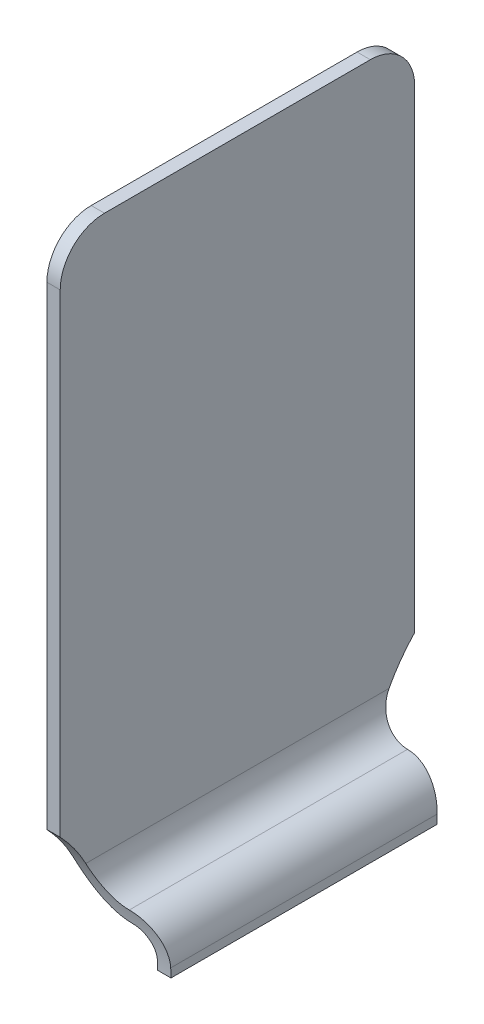
ISO-10303-21;
HEADER;
FILE_DESCRIPTION(('STEP AP214'),'2;1');
FILE_NAME('part.step','',(''),(''),'','','');
FILE_SCHEMA(('AUTOMOTIVE_DESIGN { 1 0 10303 214 1 1 1 1 }'));
ENDSEC;
DATA;
#1=APPLICATION_CONTEXT('core data for automotive mechanical design processes');
#2=APPLICATION_PROTOCOL_DEFINITION('international standard','automotive_design',2000,#1);
#3=PRODUCT_CONTEXT('',#1,'mechanical');
#4=PRODUCT('Part','Part','',(#3));
#5=PRODUCT_RELATED_PRODUCT_CATEGORY('part','',(#4));
#6=PRODUCT_DEFINITION_FORMATION('','',#4);
#7=PRODUCT_DEFINITION_CONTEXT('part definition',#1,'design');
#8=PRODUCT_DEFINITION('design','',#6,#7);
#9=PRODUCT_DEFINITION_SHAPE('','',#8);
#10=(LENGTH_UNIT() NAMED_UNIT(*) SI_UNIT(.MILLI.,.METRE.));
#11=(NAMED_UNIT(*) PLANE_ANGLE_UNIT() SI_UNIT($,.RADIAN.));
#12=(NAMED_UNIT(*) SI_UNIT($,.STERADIAN.) SOLID_ANGLE_UNIT());
#13=UNCERTAINTY_MEASURE_WITH_UNIT(LENGTH_MEASURE(1.E-05),#10,'distance_accuracy_value','');
#14=(GEOMETRIC_REPRESENTATION_CONTEXT(3) GLOBAL_UNCERTAINTY_ASSIGNED_CONTEXT((#13)) GLOBAL_UNIT_ASSIGNED_CONTEXT((#10,
#11,#12)) REPRESENTATION_CONTEXT('',''));
#15=CARTESIAN_POINT('',(0.,0.,0.));
#16=DIRECTION('',(0.,0.,1.));
#17=DIRECTION('',(1.,0.,0.));
#18=AXIS2_PLACEMENT_3D('',#15,#16,#17);
#19=CARTESIAN_POINT('',(-12.7,43.18,101.6));
#20=DIRECTION('',(0.,0.,-1.));
#21=DIRECTION('',(-1.,0.,0.));
#22=AXIS2_PLACEMENT_3D('',#19,#20,#21);
#23=CYLINDRICAL_SURFACE('',#22,25.4);
#24=DIRECTION('',(0.,0.,-1.));
#25=VECTOR('',#24,1.);
#26=CARTESIAN_POINT('',(-12.7,17.78,101.6));
#27=LINE('',#26,#25);
#28=CARTESIAN_POINT('',(-12.7,17.78,77.9314030595637));
#29=VERTEX_POINT('',#28);
#30=CARTESIAN_POINT('',(-12.7,17.78,-77.9314030595637));
#31=VERTEX_POINT('',#30);
#32=EDGE_CURVE('E180',#29,#31,#27,.T.);
#33=ORIENTED_EDGE('',*,*,#32,.F.);
#34=CARTESIAN_POINT('',(-12.7,17.78,77.9314030595637));
#35=CARTESIAN_POINT('',(-13.0499996478688,17.7799999557773,77.9314059119143));
#36=CARTESIAN_POINT('',(-13.3999568431683,17.7872354258862,77.9328253421466));
#37=CARTESIAN_POINT('',(-14.0992497530431,17.8161558254364,77.9385179026618));
#38=CARTESIAN_POINT('',(-14.448585468737,17.8378407288423,77.9427910278028));
#39=CARTESIAN_POINT('',(-15.4946792641457,17.9245225111332,77.9599188524083));
#40=CARTESIAN_POINT('',(-16.1897033388616,18.0111464859757,77.9770819818949));
#41=CARTESIAN_POINT('',(-17.5692690997434,18.2412934080639,78.0232516329426));
#42=CARTESIAN_POINT('',(-18.2538178524541,18.3847760670103,78.0522497690197));
#43=CARTESIAN_POINT('',(-19.6081739305384,18.7274954492978,78.1226996254696));
#44=CARTESIAN_POINT('',(-20.2779814894416,18.926731288711,78.1641511484035));
#45=CARTESIAN_POINT('',(-21.5984470615826,19.3794727905471,78.2603442526942));
#46=CARTESIAN_POINT('',(-22.2490937300239,19.6330098969838,78.3150935368045));
#47=CARTESIAN_POINT('',(-23.5262014706874,20.1921929563259,78.4388397647035));
#48=CARTESIAN_POINT('',(-24.1526623105987,20.4978394096021,78.5078368453056));
#49=CARTESIAN_POINT('',(-25.3768049016897,21.1585946020703,78.6611382409556));
#50=CARTESIAN_POINT('',(-25.9744925338651,21.5136931754192,78.7454394110295));
#51=CARTESIAN_POINT('',(-27.1370099880035,22.2703437940089,78.9304777410714));
#52=CARTESIAN_POINT('',(-27.7018400674534,22.6718954751478,79.0312147722169));
#53=CARTESIAN_POINT('',(-28.7936460318018,23.5170857901686,79.250002243268));
#54=CARTESIAN_POINT('',(-29.3206956673471,23.9606382736688,79.3680175032785));
#55=CARTESIAN_POINT('',(-30.3346875129469,24.8865809286975,79.6225097664561));
#56=CARTESIAN_POINT('',(-30.8216297923218,25.3689710330974,79.7589867377134));
#57=CARTESIAN_POINT('',(-31.752257755054,26.3681740201973,80.0512102841716));
#58=CARTESIAN_POINT('',(-32.1959530235636,26.8849792322877,80.2069525720158));
#59=CARTESIAN_POINT('',(-33.0376833220261,27.9485015261656,80.5383520470117));
#60=CARTESIAN_POINT('',(-33.4357183988762,28.4952185772301,80.7140092137085));
#61=CARTESIAN_POINT('',(-34.1869168527995,29.6178506732795,81.0869585391497));
#62=CARTESIAN_POINT('',(-34.5397305099014,30.1939501245122,81.2843996281286));
#63=CARTESIAN_POINT('',(-35.1956744872665,31.3666171452898,81.6999249263983));
#64=CARTESIAN_POINT('',(-35.4988035050755,31.9631852509131,81.9180096766144));
#65=CARTESIAN_POINT('',(-36.0548696654611,33.1723370569908,82.3747797484145));
#66=CARTESIAN_POINT('',(-36.3077604106159,33.7849349763711,82.6134838237389));
#67=CARTESIAN_POINT('',(-36.7628321467949,35.0207320762419,83.1107578036227));
#68=CARTESIAN_POINT('',(-36.9650165668085,35.6439305368311,83.3693263633108));
#69=CARTESIAN_POINT('',(-37.3045517222451,36.8449436479147,83.8834947192271));
#70=CARTESIAN_POINT('',(-37.4458604146121,37.4222874407772,84.1375979903023));
#71=CARTESIAN_POINT('',(-37.6867507737067,38.578784796141,84.661037335202));
#72=CARTESIAN_POINT('',(-37.7863309275198,39.1579384234931,84.9303739609269));
#73=CARTESIAN_POINT('',(-37.9444495280917,40.3134810876789,85.4825910422848));
#74=CARTESIAN_POINT('',(-38.0030931901244,40.8898734021302,85.7654347655192));
#75=CARTESIAN_POINT('',(-38.0808749708512,42.0386004944635,86.3441380062726));
#76=CARTESIAN_POINT('',(-38.100023441151,42.6109362963468,86.6399940925108));
#77=CARTESIAN_POINT('',(-38.1,43.18,86.9418470387659));
#78=B_SPLINE_CURVE_WITH_KNOTS('',3,(#34,#35,#36,#37,#38,#39,#40,#41,#42,#43,#44,#45,#46,#47,#48,
#49,#50,#51,#52,#53,#54,#55,#56,#57,#58,#59,#60,#61,#62,#63,#64,#65,#66,#67,#68,#69,#70,#71,#72,
#73,#74,#75,#76,#77),.UNSPECIFIED.,.F.,.F.,(4,2,2,2,2,2,2,2,2,2,2,2,2,2,2,2,2,2,2,2,2,4),(0.,
1.0498364949057,2.09967109818931,4.19880399000813,6.2964521533428,8.39406706181435,
10.4928999276561,12.5917529483054,14.6901751441252,16.7885808935242,18.8827720502677,
20.9769595874038,23.070681913896,25.1644020899185,27.2734454668524,29.3825441222987,
31.4935816660127,33.6044764133687,35.5422056132227,37.4800050615188,39.4128054407513,
41.3450991727097),.UNSPECIFIED.);
#79=CARTESIAN_POINT('',(-38.1,43.18,86.9418470387659));
#80=VERTEX_POINT('',#79);
#81=EDGE_CURVE('E333',#29,#80,#78,.T.);
#82=ORIENTED_EDGE('',*,*,#81,.T.);
#83=DIRECTION('',(0.,0.,-1.));
#84=VECTOR('',#83,1.);
#85=CARTESIAN_POINT('',(-38.1,43.18,101.6));
#86=LINE('',#85,#84);
#87=CARTESIAN_POINT('',(-38.1,43.18,-86.9418470387659));
#88=VERTEX_POINT('',#87);
#89=EDGE_CURVE('E184',#80,#88,#86,.T.);
#90=ORIENTED_EDGE('',*,*,#89,.T.);
#91=CARTESIAN_POINT('',(-38.1,43.18,-86.9418470387659));
#92=CARTESIAN_POINT('',(-38.0999981693521,42.8330676130882,-86.7578451581963));
#93=CARTESIAN_POINT('',(-38.0928908293818,42.4849863241756,-86.5760818146419));
#94=CARTESIAN_POINT('',(-38.0641788020595,41.7869805251087,-86.2172414157792));
#95=CARTESIAN_POINT('',(-38.0425730507946,41.4370558815564,-86.0401647053736));
#96=CARTESIAN_POINT('',(-37.9555603179967,40.3850357204068,-85.5161989694547));
#97=CARTESIAN_POINT('',(-37.8679574640963,39.6809320093932,-85.1767005439162));
#98=CARTESIAN_POINT('',(-37.6313412002912,38.2707222316856,-84.5185077883108));
#99=CARTESIAN_POINT('',(-37.4821448284482,37.5646164773349,-84.1998787454774));
#100=CARTESIAN_POINT('',(-37.1209546509072,36.1583347479351,-83.5861659913778));
#101=CARTESIAN_POINT('',(-36.9089726551131,35.45815768316,-83.2910778653304));
#102=CARTESIAN_POINT('',(-36.420533884373,34.0672823051014,-82.7245567397836));
#103=CARTESIAN_POINT('',(-36.1438302565169,33.3766312821225,-82.4532199158361));
#104=CARTESIAN_POINT('',(-35.526489905651,32.01440422067,-81.9363097318033));
#105=CARTESIAN_POINT('',(-35.1858487365238,31.3428295124752,-81.6907381652466));
#106=CARTESIAN_POINT('',(-34.4423974173309,30.0271275886868,-81.2261628884651));
#107=CARTESIAN_POINT('',(-34.0397019823121,29.3829524700522,-81.0071114603769));
#108=CARTESIAN_POINT('',(-33.1737671204304,28.1278915350359,-80.5949258524575));
#109=CARTESIAN_POINT('',(-32.7105333250935,27.5170026297149,-80.4017892653047));
#110=CARTESIAN_POINT('',(-31.7648053912232,26.3813053571327,-80.0548262623317));
#111=CARTESIAN_POINT('',(-31.2866002111259,25.8534962347817,-79.8991119010135));
#112=CARTESIAN_POINT('',(-30.2843545412095,24.8371607335537,-79.6083885940629));
#113=CARTESIAN_POINT('',(-29.7603160004625,24.3486326859357,-79.4733787686378));
#114=CARTESIAN_POINT('',(-28.6698046782257,23.4153684525297,-79.2229751783637));
#115=CARTESIAN_POINT('',(-28.1033121804295,22.9706528386449,-79.1075906101558));
#116=CARTESIAN_POINT('',(-26.9322806062266,22.1295405672176,-78.895326368492));
#117=CARTESIAN_POINT('',(-26.3277426897863,21.7331424376049,-78.7984461312208));
#118=CARTESIAN_POINT('',(-25.1089177110038,21.0065289183651,-78.6252963549697));
#119=CARTESIAN_POINT('',(-24.4958819412428,20.6743659026675,-78.5483816367503));
#120=CARTESIAN_POINT('',(-23.2431697786311,20.0610051316673,-78.4093863283812));
#121=CARTESIAN_POINT('',(-22.6034924368255,19.7798091936907,-78.3473062671636));
#122=CARTESIAN_POINT('',(-21.3025735411414,19.2709367206486,-78.2369882901384));
#123=CARTESIAN_POINT('',(-20.6413471356047,19.04322347514,-78.1887408745731));
#124=CARTESIAN_POINT('',(-19.3017164175427,18.642971428121,-78.1051360807845));
#125=CARTESIAN_POINT('',(-18.6233164764861,18.4704187350813,-78.0697754568614));
#126=CARTESIAN_POINT('',(-17.5084533745084,18.2354135933635,-78.0220937195489));
#127=CARTESIAN_POINT('',(-17.0756676243027,18.1558684230535,-78.0060927585808));
#128=CARTESIAN_POINT('',(-16.2064122464161,18.0193448690089,-77.9787660319519));
#129=CARTESIAN_POINT('',(-15.7699429172649,17.9623646741324,-77.967439891071));
#130=CARTESIAN_POINT('',(-14.895222364713,17.8712260423907,-77.9493754668979));
#131=CARTESIAN_POINT('',(-14.4569749313765,17.8370325168362,-77.9426301294209));
#132=CARTESIAN_POINT('',(-13.5791533090422,17.7914109529349,-77.9336470047907));
#133=CARTESIAN_POINT('',(-13.1395788474447,17.7799879633423,-77.931410217286));
#134=CARTESIAN_POINT('',(-12.7,17.78,-77.9314030595637));
#135=B_SPLINE_CURVE_WITH_KNOTS('',3,(#91,#92,#93,#94,#95,#96,#97,#98,#99,#100,#101,#102,#103,
#104,#105,#106,#107,#108,#109,#110,#111,#112,#113,#114,#115,#116,#117,#118,#119,#120,#121,#122,
#123,#124,#125,#126,#127,#128,#129,#130,#131,#132,#133,#134),.UNSPECIFIED.,.F.,.F.,(4,2,2,2,2,2,
2,2,2,2,2,2,2,2,2,2,2,2,2,2,2,4),(0.,1.17797477451778,2.35603599986318,4.71296445194622,
7.07694505774292,9.44048128358467,11.813183592158,14.1860509559387,16.5545832675684,
18.9228954052615,21.1072999465287,23.2916116407126,25.4769441272627,27.6622100174723,
29.7641273915488,31.8661196986582,33.9666649569446,36.066680800374,37.3871066093628,
38.7074264149734,40.0257083620563,41.3442825702244),.UNSPECIFIED.);
#136=EDGE_CURVE('E305',#88,#31,#135,.T.);
#137=ORIENTED_EDGE('',*,*,#136,.T.);
#138=EDGE_LOOP('',(#33,#82,#90,#137));
#139=FACE_BOUND('',#138,.T.);
#140=ADVANCED_FACE('F39',(#139),#23,.T.);
#141=CARTESIAN_POINT('',(-12.7,5.08,101.6));
#142=DIRECTION('',(0.,0.,-1.));
#143=DIRECTION('',(-1.,0.,0.));
#144=AXIS2_PLACEMENT_3D('',#141,#142,#143);
#145=CYLINDRICAL_SURFACE('',#144,12.7);
#146=DIRECTION('',(0.,0.,-1.));
#147=VECTOR('',#146,1.);
#148=CARTESIAN_POINT('',(0.,5.08,101.6));
#149=LINE('',#148,#147);
#150=CARTESIAN_POINT('',(0.,5.08,76.3401178551405));
#151=VERTEX_POINT('',#150);
#152=CARTESIAN_POINT('',(0.,5.08,-76.3401178551405));
#153=VERTEX_POINT('',#152);
#154=EDGE_CURVE('E171',#151,#153,#149,.T.);
#155=ORIENTED_EDGE('',*,*,#154,.F.);
#156=CARTESIAN_POINT('',(0.,5.08,76.3401178551405));
#157=CARTESIAN_POINT('',(3.96927819026589E-05,5.43752790905718,76.3598347523089));
#158=CARTESIAN_POINT('',(-0.0150957553515693,5.79492545381099,76.381675717507));
#159=CARTESIAN_POINT('',(-0.0753669800947612,6.50687834594197,76.4293110483744));
#160=CARTESIAN_POINT('',(-0.120499422788845,6.86143400473958,76.4551049744598));
#161=CARTESIAN_POINT('',(-0.240342131811877,7.56477559518426,76.5103225082011));
#162=CARTESIAN_POINT('',(-0.315016469484502,7.91356800123989,76.5397416770472));
#163=CARTESIAN_POINT('',(-0.493332468328808,8.60337293254157,76.6018067682278));
#164=CARTESIAN_POINT('',(-0.596974247098192,8.94438542619781,76.6344527036616));
#165=CARTESIAN_POINT('',(-0.832455324071245,9.61631414718369,76.7024611682484));
#166=CARTESIAN_POINT('',(-0.964299310933864,9.94722868524757,76.7378241484871));
#167=CARTESIAN_POINT('',(-1.25520299821368,10.5966302700931,76.8106599822474));
#168=CARTESIAN_POINT('',(-1.41426292314273,10.9151172143294,76.8481328531723));
#169=CARTESIAN_POINT('',(-1.75846357221544,11.5374948982324,76.9245167753253));
#170=CARTESIAN_POINT('',(-1.94360466066444,11.8413854339349,76.9634278466369));
#171=CARTESIAN_POINT('',(-2.33867478858657,12.4325041341637,77.0419601051874));
#172=CARTESIAN_POINT('',(-2.54860387535117,12.7197322668994,77.081581293781));
#173=CARTESIAN_POINT('',(-2.99359206530483,13.277806242217,77.1610844760511));
#174=CARTESIAN_POINT('',(-3.22883909025521,13.5485023382348,77.2009660149684));
#175=CARTESIAN_POINT('',(-3.72144798701313,14.0691061196502,77.2798627068802));
#176=CARTESIAN_POINT('',(-3.97881010269379,14.3190135757423,77.3188778503145));
#177=CARTESIAN_POINT('',(-4.5139378515299,14.7963241491371,77.3952339956737));
#178=CARTESIAN_POINT('',(-4.79170718956348,15.0237231624135,77.4325746916156));
#179=CARTESIAN_POINT('',(-5.36569981734714,15.454331834241,77.5047726281614));
#180=CARTESIAN_POINT('',(-5.66192275437705,15.6575419549202,77.5396299162057));
#181=CARTESIAN_POINT('',(-6.27084994830883,16.0383301873063,77.6061018534412));
#182=CARTESIAN_POINT('',(-6.58355778120708,16.2159027060666,77.6377157946492));
#183=CARTESIAN_POINT('',(-7.22320083425029,16.5440254840768,77.6969789088967));
#184=CARTESIAN_POINT('',(-7.55013596302429,16.694575916837,77.7246281073938));
#185=CARTESIAN_POINT('',(-8.21572254412766,16.9674094840857,77.7753082807231));
#186=CARTESIAN_POINT('',(-8.5543666539122,17.0897099769576,77.7983420903555));
#187=CARTESIAN_POINT('',(-9.24096045999227,17.3051605665581,77.8392660710178));
#188=CARTESIAN_POINT('',(-9.58890766474032,17.3983183850291,77.8571576044606));
#189=CARTESIAN_POINT('',(-10.3929279231379,17.5772834826273,77.8917207133021));
#190=CARTESIAN_POINT('',(-10.8513278723684,17.6532778862178,77.9065627944645));
#191=CARTESIAN_POINT('',(-11.5427044363044,17.7292874839319,77.9214435153492));
#192=CARTESIAN_POINT('',(-11.7736871687955,17.748293659439,77.9251733349672));
#193=CARTESIAN_POINT('',(-12.2364273939095,17.7736506362101,77.9301543152291));
#194=CARTESIAN_POINT('',(-12.4681850559713,17.7799984600104,77.9314048927119));
#195=CARTESIAN_POINT('',(-12.7,17.78,77.9314030595637));
#196=B_SPLINE_CURVE_WITH_KNOTS('',3,(#156,#157,#158,#159,#160,#161,#162,#163,#164,#165,#166,
#167,#168,#169,#170,#171,#172,#173,#174,#175,#176,#177,#178,#179,#180,#181,#182,#183,#184,#185,
#186,#187,#188,#189,#190,#191,#192,#193,#194,#195),.UNSPECIFIED.,.F.,.F.,(4,2,2,2,2,2,2,2,2,2,2,
2,2,2,2,2,2,2,2,4),(0.,1.07386842981975,2.14761752807789,3.22006473472719,4.2925162952012,
5.36514629110684,6.4377851358629,7.51043896487447,8.58309484036843,9.66434758803104,
10.7456122606879,11.8270737215355,12.9085145177793,13.9901908793923,15.0718602952567,
16.1528632927998,17.2335796210278,18.6249933697159,19.3200703527697,20.0153108107023),.UNSPECIFIED.);
#197=EDGE_CURVE('E324',#151,#29,#196,.T.);
#198=ORIENTED_EDGE('',*,*,#197,.T.);
#199=ORIENTED_EDGE('',*,*,#32,.T.);
#200=CARTESIAN_POINT('',(-12.7,17.78,-77.9314030595637));
#201=CARTESIAN_POINT('',(-12.3466949631906,17.7800420056863,-77.9314271102359));
#202=CARTESIAN_POINT('',(-11.9933997492598,17.7652587799894,-77.9285050771935));
#203=CARTESIAN_POINT('',(-11.28939587927,17.7063481566282,-77.9169433645126));
#204=CARTESIAN_POINT('',(-10.9386869446652,17.6622239671092,-77.9083043099744));
#205=CARTESIAN_POINT('',(-10.2428545285002,17.5450235402421,-77.8854997296049));
#206=CARTESIAN_POINT('',(-9.89772361347375,17.471989834535,-77.8713423228317));
#207=CARTESIAN_POINT('',(-9.21496697125733,17.2975558808309,-77.8378349513846));
#208=CARTESIAN_POINT('',(-8.87734124861482,17.1961556156467,-77.8184849835647));
#209=CARTESIAN_POINT('',(-8.21190089354484,16.9657464721929,-77.7750274232528));
#210=CARTESIAN_POINT('',(-7.88408791528717,16.8367329686031,-77.7509190337603));
#211=CARTESIAN_POINT('',(-7.24058370452112,16.5520773039718,-77.698486498422));
#212=CARTESIAN_POINT('',(-6.92489263830984,16.3964347777738,-77.6701622947665));
#213=CARTESIAN_POINT('',(-6.30775984721356,16.0596557867702,-77.6099180630512));
#214=CARTESIAN_POINT('',(-6.00631875750772,15.8785181869746,-77.5779978749178));
#215=CARTESIAN_POINT('',(-5.41971072222315,15.4920487054655,-77.5112472343013));
#216=CARTESIAN_POINT('',(-5.134543847533,15.2867167183761,-77.4764167691429));
#217=CARTESIAN_POINT('',(-4.57933045938471,14.8509076539266,-77.4041797688339));
#218=CARTESIAN_POINT('',(-4.30948434724324,14.6201792384612,-77.3667491476165));
#219=CARTESIAN_POINT('',(-3.79015231891764,14.1370632592111,-77.2904385720636));
#220=CARTESIAN_POINT('',(-3.54066663496979,13.884675448441,-77.2515586012038));
#221=CARTESIAN_POINT('',(-3.06367311321691,13.3599128025082,-77.1731297502517));
#222=CARTESIAN_POINT('',(-2.83617026994782,13.0875334498548,-77.1335807205353));
#223=CARTESIAN_POINT('',(-2.40474283813566,12.5246901986731,-77.0546031710346));
#224=CARTESIAN_POINT('',(-2.20081805776936,12.2342264473032,-77.0151746502723));
#225=CARTESIAN_POINT('',(-1.81554297995369,11.6334357962443,-76.9367037926197));
#226=CARTESIAN_POINT('',(-1.63450662544897,11.3229060383154,-76.8976724387105));
#227=CARTESIAN_POINT('',(-1.29932576880851,10.6874658170685,-76.8212436702971));
#228=CARTESIAN_POINT('',(-1.14518145465169,10.3625552532467,-76.7838462672158));
#229=CARTESIAN_POINT('',(-0.864987959785353,9.70076869641039,-76.7113798310754));
#230=CARTESIAN_POINT('',(-0.738924292048551,9.36389897770836,-76.6763096039955));
#231=CARTESIAN_POINT('',(-0.515778486381247,8.68055547672783,-76.6090865987976));
#232=CARTESIAN_POINT('',(-0.418689542219729,8.33408397086301,-76.5769331367617));
#233=CARTESIAN_POINT('',(-0.224871484110284,7.50878628738693,-76.5051718812074));
#234=CARTESIAN_POINT('',(-0.140612019132547,7.02681300189326,-76.4669935450762));
#235=CARTESIAN_POINT('',(-0.0562950150327749,6.29918810208349,-76.4152099649003));
#236=CARTESIAN_POINT('',(-0.03520141508771,6.05596605308697,-76.3988681373186));
#237=CARTESIAN_POINT('',(-0.00705358222639746,5.56853671523523,-76.368065107081));
#238=CARTESIAN_POINT('',(-2.53929975079959E-06,5.32432921514111,-76.3536043324332));
#239=CARTESIAN_POINT('',(0.,5.08,-76.3401178551405));
#240=B_SPLINE_CURVE_WITH_KNOTS('',3,(#200,#201,#202,#203,#204,#205,#206,#207,#208,#209,#210,
#211,#212,#213,#214,#215,#216,#217,#218,#219,#220,#221,#222,#223,#224,#225,#226,#227,#228,#229,
#230,#231,#232,#233,#234,#235,#236,#237,#238,#239),.UNSPECIFIED.,.F.,.F.,(4,2,2,2,2,2,2,2,2,2,2,
2,2,2,2,2,2,2,2,4),(0.,1.05957922329203,2.11904261108065,3.1769530765825,4.23486418307,
5.29295263247609,6.35105559231693,7.40920567170577,8.46736035992262,9.53713358255137,
10.6069190055826,11.6769469168349,12.7469661220855,13.8303566488204,14.9137547482945,
15.9965926128848,17.0791759157283,18.5477331027743,19.2814317836532,20.0152971168244),.UNSPECIFIED.);
#241=EDGE_CURVE('E296',#31,#153,#240,.T.);
#242=ORIENTED_EDGE('',*,*,#241,.T.);
#243=EDGE_LOOP('',(#155,#198,#199,#242));
#244=FACE_BOUND('',#243,.T.);
#245=ADVANCED_FACE('F313',(#244),#145,.F.);
#246=CARTESIAN_POINT('',(0.,0.,101.6));
#247=DIRECTION('',(-1.,0.,0.));
#248=DIRECTION('',(0.,0.,1.));
#249=AXIS2_PLACEMENT_3D('',#246,#247,#248);
#250=PLANE('',#249);
#251=DIRECTION('',(0.,0.,-1.));
#252=VECTOR('',#251,1.);
#253=CARTESIAN_POINT('',(0.,0.,101.6));
#254=LINE('',#253,#252);
#255=CARTESIAN_POINT('',(0.,0.,76.2));
#256=VERTEX_POINT('',#255);
#257=CARTESIAN_POINT('',(0.,0.,-76.2));
#258=VERTEX_POINT('',#257);
#259=EDGE_CURVE('E159',#256,#258,#254,.T.);
#260=ORIENTED_EDGE('',*,*,#259,.F.);
#261=CARTESIAN_POINT('',(0.,0.,168.358251307205));
#262=DIRECTION('',(-1.,0.,0.));
#263=DIRECTION('',(0.,0.,1.));
#264=AXIS2_PLACEMENT_3D('',#261,#262,#263);
#265=CIRCLE('',#264,92.1582513072045);
#266=EDGE_CURVE('E334',#256,#151,#265,.F.);
#267=ORIENTED_EDGE('',*,*,#266,.T.);
#268=ORIENTED_EDGE('',*,*,#154,.T.);
#269=CARTESIAN_POINT('',(0.,0.,-168.358251307204));
#270=DIRECTION('',(-1.,0.,0.));
#271=DIRECTION('',(0.,0.,1.));
#272=AXIS2_PLACEMENT_3D('',#269,#270,#271);
#273=CIRCLE('',#272,92.1582513072045);
#274=EDGE_CURVE('E306',#153,#258,#273,.F.);
#275=ORIENTED_EDGE('',*,*,#274,.T.);
#276=EDGE_LOOP('',(#260,#267,#268,#275));
#277=FACE_BOUND('',#276,.T.);
#278=ADVANCED_FACE('F317',(#277),#250,.T.);
#279=CARTESIAN_POINT('',(7.62,0.,101.6));
#280=DIRECTION('',(0.,-1.,0.));
#281=DIRECTION('',(0.,0.,-1.));
#282=AXIS2_PLACEMENT_3D('',#279,#280,#281);
#283=PLANE('',#282);
#284=DIRECTION('',(0.,0.,-1.));
#285=VECTOR('',#284,1.);
#286=CARTESIAN_POINT('',(7.62,0.,101.6));
#287=LINE('',#286,#285);
#288=CARTESIAN_POINT('',(7.62,0.,76.2));
#289=VERTEX_POINT('',#288);
#290=CARTESIAN_POINT('',(7.62,0.,-76.2));
#291=VERTEX_POINT('',#290);
#292=EDGE_CURVE('E157',#289,#291,#287,.T.);
#293=ORIENTED_EDGE('',*,*,#292,.F.);
#294=DIRECTION('',(-1.,0.,0.));
#295=VECTOR('',#294,1.);
#296=CARTESIAN_POINT('',(18.542,0.,76.2));
#297=LINE('',#296,#295);
#298=EDGE_CURVE('E161',#289,#256,#297,.T.);
#299=ORIENTED_EDGE('',*,*,#298,.T.);
#300=ORIENTED_EDGE('',*,*,#259,.T.);
#301=DIRECTION('',(-1.,0.,0.));
#302=VECTOR('',#301,1.);
#303=CARTESIAN_POINT('',(18.542,0.,-76.2));
#304=LINE('',#303,#302);
#305=EDGE_CURVE('E141',#291,#258,#304,.T.);
#306=ORIENTED_EDGE('',*,*,#305,.F.);
#307=EDGE_LOOP('',(#293,#299,#300,#306));
#308=FACE_BOUND('',#307,.T.);
#309=ADVANCED_FACE('F155',(#308),#283,.T.);
#310=CARTESIAN_POINT('',(7.62,0.,101.6));
#311=DIRECTION('',(-1.,0.,0.));
#312=DIRECTION('',(0.,0.,1.));
#313=AXIS2_PLACEMENT_3D('',#310,#311,#312);
#314=PLANE('',#313);
#315=CARTESIAN_POINT('',(7.62,0.,168.358251307205));
#316=DIRECTION('',(-1.,0.,0.));
#317=DIRECTION('',(0.,0.,1.));
#318=AXIS2_PLACEMENT_3D('',#315,#316,#317);
#319=CIRCLE('',#318,92.1582513072045);
#320=CARTESIAN_POINT('',(7.62,5.08,76.3401178551405));
#321=VERTEX_POINT('',#320);
#322=EDGE_CURVE('E165',#289,#321,#319,.F.);
#323=ORIENTED_EDGE('',*,*,#322,.F.);
#324=ORIENTED_EDGE('',*,*,#292,.T.);
#325=CARTESIAN_POINT('',(7.62,0.,-168.358251307204));
#326=DIRECTION('',(-1.,0.,0.));
#327=DIRECTION('',(0.,0.,1.));
#328=AXIS2_PLACEMENT_3D('',#325,#326,#327);
#329=CIRCLE('',#328,92.1582513072045);
#330=CARTESIAN_POINT('',(7.62,5.08,-76.3401178551405));
#331=VERTEX_POINT('',#330);
#332=EDGE_CURVE('E138',#331,#291,#329,.F.);
#333=ORIENTED_EDGE('',*,*,#332,.F.);
#334=DIRECTION('',(0.,0.,-1.));
#335=VECTOR('',#334,1.);
#336=CARTESIAN_POINT('',(7.62,5.08,101.6));
#337=LINE('',#336,#335);
#338=EDGE_CURVE('E167',#321,#331,#337,.T.);
#339=ORIENTED_EDGE('',*,*,#338,.F.);
#340=EDGE_LOOP('',(#323,#324,#333,#339));
#341=FACE_BOUND('',#340,.T.);
#342=ADVANCED_FACE('F164',(#341),#314,.F.);
#343=CARTESIAN_POINT('',(-12.7,5.08,101.6));
#344=DIRECTION('',(0.,0.,-1.));
#345=DIRECTION('',(-1.,0.,0.));
#346=AXIS2_PLACEMENT_3D('',#343,#344,#345);
#347=CYLINDRICAL_SURFACE('',#346,20.32);
#348=CARTESIAN_POINT('',(7.62,5.08,76.3401178551405));
#349=CARTESIAN_POINT('',(7.62000072832361,5.36459364116475,76.3558273305643));
#350=CARTESIAN_POINT('',(7.61402039114236,5.64908074252341,76.3728595116245));
#351=CARTESIAN_POINT('',(7.59013708862588,6.21737621788287,76.4095235511956));
#352=CARTESIAN_POINT('',(7.57223454486734,6.50118461552694,76.4291553177638));
#353=CARTESIAN_POINT('',(7.50072097702547,7.35070068391277,76.4918667582618));
#354=CARTESIAN_POINT('',(7.4293039514507,7.91472384585887,76.538775003952));
#355=CARTESIAN_POINT('',(7.23985719635724,9.03290651822983,76.6420336378629));
#356=CARTESIAN_POINT('',(7.12191456536921,9.58708244889635,76.6983662702685));
#357=CARTESIAN_POINT('',(6.91089643733185,10.4087112736707,76.7892713116339));
#358=CARTESIAN_POINT('',(6.83486748896494,10.6809976278656,76.8206427327531));
#359=CARTESIAN_POINT('',(6.67157550231272,11.222012794108,76.8853922289441));
#360=CARTESIAN_POINT('',(6.58430971857321,11.4907407189833,76.9187707933479));
#361=CARTESIAN_POINT('',(6.30600377737789,12.2906018773402,77.0216589921474));
#362=CARTESIAN_POINT('',(6.09838006610346,12.8157039766999,77.0939535839107));
#363=CARTESIAN_POINT('',(5.64054808602691,13.8461024611382,77.244586509001));
#364=CARTESIAN_POINT('',(5.39033896609933,14.3513984501172,77.3229249631055));
#365=CARTESIAN_POINT('',(4.98448358108528,15.0920325835157,77.4438049550938));
#366=CARTESIAN_POINT('',(4.84406287168603,15.336094131368,77.4846727173473));
#367=CARTESIAN_POINT('',(4.55331719523271,15.8179988588571,77.5673159545462));
#368=CARTESIAN_POINT('',(4.40299477020926,16.0558436127755,77.6090911946865));
#369=CARTESIAN_POINT('',(3.9374648243116,16.7596188490942,77.7354863539442));
#370=CARTESIAN_POINT('',(3.60767467289658,17.2158267101244,77.8211816966306));
#371=CARTESIAN_POINT('',(2.90502873895056,18.1074217782342,77.9952343292217));
#372=CARTESIAN_POINT('',(2.5314826365727,18.5422597170677,78.083611425126));
#373=CARTESIAN_POINT('',(1.74890703939083,19.3789374596272,78.259511943077));
#374=CARTESIAN_POINT('',(1.33987691244988,19.7807766752428,78.3470353498846));
#375=CARTESIAN_POINT('',(0.488849907190628,20.5488443988731,78.5192662636852));
#376=CARTESIAN_POINT('',(0.0468466857726222,20.9150660236833,78.6039732243183));
#377=CARTESIAN_POINT('',(-0.638478110804725,21.4355630885052,78.7273875750494));
#378=CARTESIAN_POINT('',(-0.870648096648567,21.6042615360458,78.7679193453765));
#379=CARTESIAN_POINT('',(-1.34215676933814,21.9318314321536,78.8475454577737));
#380=CARTESIAN_POINT('',(-1.58149740032596,22.0907001791933,78.8866394034952));
#381=CARTESIAN_POINT('',(-2.31252554831257,22.5538900773249,79.0018467679538));
#382=CARTESIAN_POINT('',(-2.81453466206102,22.8427545318304,79.0753980055657));
#383=CARTESIAN_POINT('',(-3.84234164400945,23.3769863739926,79.2137841484371));
#384=CARTESIAN_POINT('',(-4.36813904718293,23.6223546114763,79.2786192239866));
#385=CARTESIAN_POINT('',(-5.17159769377982,23.9561668097035,79.3680352063529));
#386=CARTESIAN_POINT('',(-5.44182423506069,24.0617138270153,79.3965296977911));
#387=CARTESIAN_POINT('',(-5.98670757873532,24.2611958722763,79.4507244946029));
#388=CARTESIAN_POINT('',(-6.26136307539405,24.3551342543769,79.4764256068242));
#389=CARTESIAN_POINT('',(-7.09128904806682,24.6192311125903,79.5490720572632));
#390=CARTESIAN_POINT('',(-7.65272122434698,24.7717553436129,79.5915832087307));
#391=CARTESIAN_POINT('',(-8.58680324267506,24.9829065596217,79.6508392838661));
#392=CARTESIAN_POINT('',(-8.95611473292736,25.055672116989,79.67138202465));
#393=CARTESIAN_POINT('',(-9.69847136434728,25.1806175228481,79.7067763456842));
#394=CARTESIAN_POINT('',(-10.0715160928484,25.2327996213864,79.7216285479811));
#395=CARTESIAN_POINT('',(-10.8197911328324,25.3163237857574,79.7454473858078));
#396=CARTESIAN_POINT('',(-11.1950193369464,25.3476833813167,79.754418971938));
#397=CARTESIAN_POINT('',(-11.9468288328742,25.3895312889628,79.7664059770021));
#398=CARTESIAN_POINT('',(-12.3234104475309,25.4000142371694,79.7694198652109));
#399=CARTESIAN_POINT('',(-12.7,25.4,79.7694072917087));
#400=B_SPLINE_CURVE_WITH_KNOTS('',3,(#348,#349,#350,#351,#352,#353,#354,#355,#356,#357,#358,
#359,#360,#361,#362,#363,#364,#365,#366,#367,#368,#369,#370,#371,#372,#373,#374,#375,#376,#377,
#378,#379,#380,#381,#382,#383,#384,#385,#386,#387,#388,#389,#390,#391,#392,#393,#394,#395,#396,
#397,#398,#399),.UNSPECIFIED.,.F.,.F.,(4,2,2,2,2,2,2,2,2,2,2,2,2,2,2,2,2,2,2,2,2,2,2,2,2,4),(0.,
0.854948621106065,1.709867012299,3.41903117816875,5.12501076317492,5.97810214433587,
6.83140235504321,8.53709756161125,10.242826862748,11.0961881547634,11.9493312139917,
13.6554918809542,15.3935753460455,17.1316897809178,18.870139446864,19.7394242480719,
20.6089469059743,22.3581798180902,24.1073785500072,24.9816414347362,25.8556511199681,
27.6030122138763,28.7333948348281,29.8636538556237,30.9929601409275,32.1225565438156),.UNSPECIFIED.);
#401=CARTESIAN_POINT('',(-12.7,25.4,79.7694072917086));
#402=VERTEX_POINT('',#401);
#403=EDGE_CURVE('E264',#321,#402,#400,.T.);
#404=ORIENTED_EDGE('',*,*,#403,.F.);
#405=ORIENTED_EDGE('',*,*,#338,.T.);
#406=CARTESIAN_POINT('',(-12.7,25.4,-79.7694072917087));
#407=CARTESIAN_POINT('',(-12.4204439296159,25.40000098863,-79.7694095345285));
#408=CARTESIAN_POINT('',(-12.1409202320686,25.3942301473352,-79.7677527361615));
#409=CARTESIAN_POINT('',(-11.5823961901754,25.3711676733953,-79.7611444423404));
#410=CARTESIAN_POINT('',(-11.3033958297922,25.3538763997667,-79.7561930495573));
#411=CARTESIAN_POINT('',(-10.4680625013261,25.2847739750635,-79.736437126802));
#412=CARTESIAN_POINT('',(-9.9131747251194,25.2157341813269,-79.7167308161416));
#413=CARTESIAN_POINT('',(-8.81278650565686,25.0325035946998,-79.6648126486192));
#414=CARTESIAN_POINT('',(-8.26726786530831,24.9184139814618,-79.6326288185654));
#415=CARTESIAN_POINT('',(-7.45811410057926,24.7142171359528,-79.5756197913851));
#416=CARTESIAN_POINT('',(-7.18990142738002,24.6406358353247,-79.5551597803066));
#417=CARTESIAN_POINT('',(-6.65686311034195,24.4825820805115,-79.5114551403416));
#418=CARTESIAN_POINT('',(-6.39203830069422,24.3981069986114,-79.4882098397049));
#419=CARTESIAN_POINT('',(-5.60362739870339,24.1286799237247,-79.4145338297331));
#420=CARTESIAN_POINT('',(-5.0858108606958,23.9276518139106,-79.3601420671741));
#421=CARTESIAN_POINT('',(-4.06923819572578,23.4843436875698,-79.2421392771758));
#422=CARTESIAN_POINT('',(-3.57048260169677,23.2420625186622,-79.1785279922016));
#423=CARTESIAN_POINT('',(-2.83903405184184,22.8490873339325,-79.0773420207116));
#424=CARTESIAN_POINT('',(-2.59792575465082,22.713122801721,-79.0426400794788));
#425=CARTESIAN_POINT('',(-2.12170988302252,22.4316185842779,-78.9715249419445));
#426=CARTESIAN_POINT('',(-1.88660078457804,22.2860813651424,-78.9351121870645));
#427=CARTESIAN_POINT('',(-1.19068471035365,21.8354008967388,-78.8235968247058));
#428=CARTESIAN_POINT('',(-0.739255888609462,21.5161710580333,-78.7462125033267));
#429=CARTESIAN_POINT('',(0.145643072023718,20.8347115056383,-78.5852964690186));
#430=CARTESIAN_POINT('',(0.578461680062892,20.4716619048772,-78.5016643240954));
#431=CARTESIAN_POINT('',(1.41213060360601,19.7110803807415,-78.3317641604363));
#432=CARTESIAN_POINT('',(1.8129803428263,19.3135478360332,-78.2454960942229));
#433=CARTESIAN_POINT('',(2.58024986323449,18.4865142824442,-78.0722026443318));
#434=CARTESIAN_POINT('',(2.94666125931218,18.0570055333253,-77.985177081824));
#435=CARTESIAN_POINT('',(3.6425869648174,17.168859663293,-77.8122509241886));
#436=CARTESIAN_POINT('',(3.97210136499316,16.7102226140251,-77.7263503262946));
#437=CARTESIAN_POINT('',(4.5993865432346,15.7555566222979,-77.5554631000151));
#438=CARTESIAN_POINT('',(4.89622103239028,15.2588994742312,-77.4705462643578));
#439=CARTESIAN_POINT('',(5.44677796884665,14.241411340159,-77.3055683163438));
#440=CARTESIAN_POINT('',(5.70049725379423,13.7205785845192,-77.2255075604409));
#441=CARTESIAN_POINT('',(6.16268916057907,12.6586858362524,-77.0719512434753));
#442=CARTESIAN_POINT('',(6.37119072107453,12.1176390417957,-76.9984515012931));
#443=CARTESIAN_POINT('',(6.74140809827912,11.0188524811842,-76.8594284120897));
#444=CARTESIAN_POINT('',(6.90313491044149,10.4611166722283,-76.7939031925793));
#445=CARTESIAN_POINT('',(7.13669192146353,9.50401101153976,-76.6905165703004));
#446=CARTESIAN_POINT('',(7.22091236913216,9.10787135778231,-76.6502895009444));
#447=CARTESIAN_POINT('',(7.36558652767079,8.31088239178029,-76.5746325059599));
#448=CARTESIAN_POINT('',(7.42604521719709,7.91003408425768,-76.5392015764465));
#449=CARTESIAN_POINT('',(7.52287440923586,7.10530166266762,-76.4734283807233));
#450=CARTESIAN_POINT('',(7.55926098213534,6.70141975634753,-76.4430827297407));
#451=CARTESIAN_POINT('',(7.60783537934178,5.8917454457109,-76.3876256357899));
#452=CARTESIAN_POINT('',(7.62001719522667,5.48595259208558,-76.3625154938325));
#453=CARTESIAN_POINT('',(7.62,5.08000000000001,-76.3401178551405));
#454=B_SPLINE_CURVE_WITH_KNOTS('',3,(#406,#407,#408,#409,#410,#411,#412,#413,#414,#415,#416,
#417,#418,#419,#420,#421,#422,#423,#424,#425,#426,#427,#428,#429,#430,#431,#432,#433,#434,#435,
#436,#437,#438,#439,#440,#441,#442,#443,#444,#445,#446,#447,#448,#449,#450,#451,#452,#453),
.UNSPECIFIED.,.F.,.F.,(4,2,2,2,2,2,2,2,2,2,2,2,2,2,2,2,2,2,2,2,2,2,2,4),(0.,0.838539309650927,
1.67705248872816,3.35341340788775,5.02603052565091,5.86243712386343,6.6990458523983,
8.37135444222224,10.0437097547092,10.8804118422195,11.716899218141,13.3897608350635,
15.1010842409287,16.8124384888269,18.5242083467329,20.2359739944455,21.9882680070601,
23.7406904890394,25.4919881157405,27.242873725442,28.463144353352,29.6831591689211,
30.9023586865004,32.1218608119741),.UNSPECIFIED.);
#455=CARTESIAN_POINT('',(-12.7,25.4,-79.7694072917087));
#456=VERTEX_POINT('',#455);
#457=EDGE_CURVE('E144',#456,#331,#454,.T.);
#458=ORIENTED_EDGE('',*,*,#457,.F.);
#459=DIRECTION('',(0.,0.,-1.));
#460=VECTOR('',#459,1.);
#461=CARTESIAN_POINT('',(-12.7,25.4,101.6));
#462=LINE('',#461,#460);
#463=EDGE_CURVE('E173',#402,#456,#462,.T.);
#464=ORIENTED_EDGE('',*,*,#463,.F.);
#465=EDGE_LOOP('',(#404,#405,#458,#464));
#466=FACE_BOUND('',#465,.T.);
#467=ADVANCED_FACE('F263',(#466),#347,.T.);
#468=CARTESIAN_POINT('',(-12.7,43.18,101.6));
#469=DIRECTION('',(0.,0.,-1.));
#470=DIRECTION('',(-1.,0.,0.));
#471=AXIS2_PLACEMENT_3D('',#468,#469,#470);
#472=CYLINDRICAL_SURFACE('',#471,17.78);
#473=CARTESIAN_POINT('',(-12.7,25.4,79.7694072917086));
#474=CARTESIAN_POINT('',(-12.9414738791222,25.3999991793735,79.76940848058));
#475=CARTESIAN_POINT('',(-13.1829206122829,25.4049199219056,79.7708177485278));
#476=CARTESIAN_POINT('',(-13.6653746536369,25.4245855582804,79.7764592406434));
#477=CARTESIAN_POINT('',(-13.9063819725313,25.4393302095862,79.7806913951186));
#478=CARTESIAN_POINT('',(-14.6280469039881,25.4982606512424,79.7976292470994));
#479=CARTESIAN_POINT('',(-15.1074865527479,25.5571429521224,79.8145763264641));
#480=CARTESIAN_POINT('',(-16.0588319950924,25.7134972531043,79.8598561774407));
#481=CARTESIAN_POINT('',(-16.5307469043684,25.8109181727785,79.8881738787782));
#482=CARTESIAN_POINT('',(-17.2308080744853,25.9852896931509,79.9392963068903));
#483=CARTESIAN_POINT('',(-17.4628700101116,26.0481236226719,79.9577791030001));
#484=CARTESIAN_POINT('',(-17.9240853712426,26.1830861524377,79.9976591860325));
#485=CARTESIAN_POINT('',(-18.1532380514175,26.2552170837492,80.0190572039748));
#486=CARTESIAN_POINT('',(-18.83571144983,26.4853332889285,80.087666539644));
#487=CARTESIAN_POINT('',(-19.2840458605165,26.657041558583,80.1392930184134));
#488=CARTESIAN_POINT('',(-20.164080822892,27.0354862911724,80.2545349645901));
#489=CARTESIAN_POINT('',(-20.5957811988932,27.2422231239525,80.318150558584));
#490=CARTESIAN_POINT('',(-21.2285745264998,27.5771528637308,80.422720528992));
#491=CARTESIAN_POINT('',(-21.4370743429052,27.6929515334449,80.4591073688504));
#492=CARTESIAN_POINT('',(-21.8487816567502,27.9325441568756,80.5349511320871));
#493=CARTESIAN_POINT('',(-22.0519904996544,28.0563360495388,80.574407264581));
#494=CARTESIAN_POINT('',(-22.6532871767158,28.4393675035112,80.6974414005441));
#495=CARTESIAN_POINT('',(-23.0430824815758,28.7102826247864,80.785691280472));
#496=CARTESIAN_POINT('',(-23.8007356622403,29.282900882778,80.9754918734184));
#497=CARTESIAN_POINT('',(-24.168401480912,29.584825051295,81.0771397824687));
#498=CARTESIAN_POINT('',(-24.8763305210375,30.2150497879334,81.2933043584979));
#499=CARTESIAN_POINT('',(-25.2165936472889,30.5433504476841,81.4078210701824));
#500=CARTESIAN_POINT('',(-25.8677595606699,31.2234065718869,81.6497029011125));
#501=CARTESIAN_POINT('',(-26.1786650881595,31.5751598419355,81.7770668188468));
#502=CARTESIAN_POINT('',(-26.7696030627541,32.2991442185169,82.0445358800288));
#503=CARTESIAN_POINT('',(-27.0496350697647,32.671375616847,82.1846412050501));
#504=CARTESIAN_POINT('',(-27.5860913923072,33.4454497722433,82.4820468078171));
#505=CARTESIAN_POINT('',(-27.8414723049453,33.8478590953079,82.6397540945772));
#506=CARTESIAN_POINT('',(-28.3171749676907,34.667835988004,82.9680910437722));
#507=CARTESIAN_POINT('',(-28.5374953328194,35.0854041556478,83.1387212163002));
#508=CARTESIAN_POINT('',(-28.9427395639363,35.9327534133008,83.4925250362448));
#509=CARTESIAN_POINT('',(-29.1276305381023,36.3625454306946,83.6757101272482));
#510=CARTESIAN_POINT('',(-29.4615961578835,37.2307466411604,84.0538092664516));
#511=CARTESIAN_POINT('',(-29.6106726768858,37.6691553822094,84.2487227004968));
#512=CARTESIAN_POINT('',(-29.8665952232221,38.5294499373932,84.6394561120606));
#513=CARTESIAN_POINT('',(-29.9751830160642,38.9510629375502,84.8347412862369));
#514=CARTESIAN_POINT('',(-30.1605518327167,39.7969514792071,85.234459035475));
#515=CARTESIAN_POINT('',(-30.2373311895436,40.2212271590675,85.4388920893274));
#516=CARTESIAN_POINT('',(-30.3594264502996,41.0690733509457,85.8555437325589));
#517=CARTESIAN_POINT('',(-30.4048228561201,41.4926428659105,86.0677409207716));
#518=CARTESIAN_POINT('',(-30.4651125129202,42.3380716833542,86.4994868442005));
#519=CARTESIAN_POINT('',(-30.4800137522204,42.7599314048143,86.7190336388407));
#520=CARTESIAN_POINT('',(-30.48,43.18,86.9418470387658));
#521=B_SPLINE_CURVE_WITH_KNOTS('',3,(#473,#474,#475,#476,#477,#478,#479,#480,#481,#482,#483,
#484,#485,#486,#487,#488,#489,#490,#491,#492,#493,#494,#495,#496,#497,#498,#499,#500,#501,#502,
#503,#504,#505,#506,#507,#508,#509,#510,#511,#512,#513,#514,#515,#516,#517,#518,#519,#520),
.UNSPECIFIED.,.F.,.F.,(4,2,2,2,2,2,2,2,2,2,2,2,2,2,2,2,2,2,2,2,2,2,2,4),(0.,0.724313231405512,
1.44860858132402,2.89678346473277,4.34304528359809,5.06624008447813,5.78961656829999,
7.23637468134681,8.68314807077996,9.40673804842129,10.1301421876712,11.5768228123498,
13.034644325804,14.4924709038094,15.9501612674486,17.4078724074179,18.9122725562044,
20.4167321177893,21.9225816887746,23.4283524744282,24.8586730303297,26.2890685355041,
27.7157811131623,29.1421199103687),.UNSPECIFIED.);
#522=CARTESIAN_POINT('',(-30.48,43.18,86.9418470387658));
#523=VERTEX_POINT('',#522);
#524=EDGE_CURVE('E260',#402,#523,#521,.T.);
#525=ORIENTED_EDGE('',*,*,#524,.F.);
#526=ORIENTED_EDGE('',*,*,#463,.T.);
#527=CARTESIAN_POINT('',(-30.48,43.18,-86.9418470387658));
#528=CARTESIAN_POINT('',(-30.4799982450895,42.926586246552,-86.8074448825316));
#529=CARTESIAN_POINT('',(-30.4745814440178,42.6725666922173,-86.6742411798539));
#530=CARTESIAN_POINT('',(-30.4527558682847,42.1636539595382,-86.4103916734022));
#531=CARTESIAN_POINT('',(-30.4363464097048,41.9087607278187,-86.2797460293007));
#532=CARTESIAN_POINT('',(-30.3703739589208,41.1431714360228,-85.8918347766893));
#533=CARTESIAN_POINT('',(-30.3040666962228,40.631718735384,-85.6386759490912));
#534=CARTESIAN_POINT('',(-30.1254390921997,39.6088590534978,-85.1440362026952));
#535=CARTESIAN_POINT('',(-30.0129507373769,39.0974591319666,-84.902601563066));
#536=CARTESIAN_POINT('',(-29.7412019161932,38.0807221212937,-84.4337903019481));
#537=CARTESIAN_POINT('',(-29.5819492665482,37.5753840335896,-84.2064113387167));
#538=CARTESIAN_POINT('',(-29.2156402624075,36.573366343694,-83.766095952599));
#539=CARTESIAN_POINT('',(-29.0084112614899,36.0767251526896,-83.5532153724874));
#540=CARTESIAN_POINT('',(-28.5466266422458,35.0988375048716,-83.14384007075));
#541=CARTESIAN_POINT('',(-28.2920679667675,34.6175920448649,-82.947346408788));
#542=CARTESIAN_POINT('',(-27.7369669163239,33.6765334049929,-82.5719437113962));
#543=CARTESIAN_POINT('',(-27.4365136976556,33.2166808787447,-82.3930016632158));
#544=CARTESIAN_POINT('',(-26.7907700028691,32.3226247412572,-82.0528634215528));
#545=CARTESIAN_POINT('',(-26.4454843550588,31.8884183753249,-81.8916653205535));
#546=CARTESIAN_POINT('',(-25.7432320211397,31.0861059554974,-81.6001744645939));
#547=CARTESIAN_POINT('',(-25.3897076670657,30.7155137213179,-81.4684217368116));
#548=CARTESIAN_POINT('',(-24.6491615338754,30.0038988341974,-81.2201346306777));
#549=CARTESIAN_POINT('',(-24.2621411996693,29.6628749070424,-81.1035995964264));
#550=CARTESIAN_POINT('',(-23.4570551763902,29.0137894361654,-80.8856235280858));
#551=CARTESIAN_POINT('',(-23.0389777620258,28.7057404500453,-80.7841882386162));
#552=CARTESIAN_POINT('',(-22.3912582379755,28.2710896080856,-80.6433040078498));
#553=CARTESIAN_POINT('',(-22.1719106092392,28.1307724531548,-80.5982194745276));
#554=CARTESIAN_POINT('',(-21.7266643003108,27.8595662659617,-80.511748221263));
#555=CARTESIAN_POINT('',(-21.5007638539599,27.7286798092705,-80.4703625107513));
#556=CARTESIAN_POINT('',(-20.8425949889677,27.36651000836,-80.3566674094534));
#557=CARTESIAN_POINT('',(-20.4026574875865,27.1475538315777,-80.2889742815912));
#558=CARTESIAN_POINT('',(-19.5046767025324,26.7462968017774,-80.1662847198555));
#559=CARTESIAN_POINT('',(-19.0466341161305,26.5639945387702,-80.1112877975769));
#560=CARTESIAN_POINT('',(-18.3488328580104,26.3193998525777,-80.0381536213724));
#561=CARTESIAN_POINT('',(-18.1145217718244,26.2426985803573,-80.0153417343822));
#562=CARTESIAN_POINT('',(-17.6427181277338,26.09905364484,-79.9727983854685));
#563=CARTESIAN_POINT('',(-17.4052264134088,26.03210744811,-79.9530661236587));
#564=CARTESIAN_POINT('',(-16.6886841574562,25.8461547714103,-79.8984502374071));
#565=CARTESIAN_POINT('',(-16.2053536244335,25.7419595621441,-79.8681253348724));
#566=CARTESIAN_POINT('',(-15.2200307557021,25.5722351525584,-79.8189261632651));
#567=CARTESIAN_POINT('',(-14.7178638385625,25.5076371774476,-79.8003273953199));
#568=CARTESIAN_POINT('',(-13.9621708532818,25.4430560362704,-79.7817611430157));
#569=CARTESIAN_POINT('',(-13.710043958201,25.4269149793734,-79.7771276951985));
#570=CARTESIAN_POINT('',(-13.2052886591152,25.4053864312355,-79.7709514648356));
#571=CARTESIAN_POINT('',(-12.9526602452279,25.3999991540445,-79.7694087438096));
#572=CARTESIAN_POINT('',(-12.7,25.4,-79.7694072917087));
#573=B_SPLINE_CURVE_WITH_KNOTS('',3,(#527,#528,#529,#530,#531,#532,#533,#534,#535,#536,#537,
#538,#539,#540,#541,#542,#543,#544,#545,#546,#547,#548,#549,#550,#551,#552,#553,#554,#555,#556,
#557,#558,#559,#560,#561,#562,#563,#564,#565,#566,#567,#568,#569,#570,#571,#572),.UNSPECIFIED.,
.F.,.F.,(4,2,2,2,2,2,2,2,2,2,2,2,2,2,2,2,2,2,2,2,2,2,4),(0.,0.860437066535881,1.72092767094258,
3.44242677853406,5.17024524688209,6.89777507225076,8.63162092080632,10.365578802097,
12.0962100988511,13.8266551665515,15.4111283879517,16.9955332942322,18.5805394470294,
19.3730923613195,20.1658609117426,21.6520831351475,23.1382481761648,23.8808419582957,
24.6232425407408,26.1073660222397,27.6251728159786,28.3830128288853,29.1408679261485),.UNSPECIFIED.);
#574=CARTESIAN_POINT('',(-30.48,43.18,-86.9418470387658));
#575=VERTEX_POINT('',#574);
#576=EDGE_CURVE('E259',#575,#456,#573,.T.);
#577=ORIENTED_EDGE('',*,*,#576,.F.);
#578=DIRECTION('',(0.,0.,-1.));
#579=VECTOR('',#578,1.);
#580=CARTESIAN_POINT('',(-30.48,43.18,101.6));
#581=LINE('',#580,#579);
#582=EDGE_CURVE('E248',#523,#575,#581,.T.);
#583=ORIENTED_EDGE('',*,*,#582,.F.);
#584=EDGE_LOOP('',(#525,#526,#577,#583));
#585=FACE_BOUND('',#584,.T.);
#586=ADVANCED_FACE('F257',(#585),#472,.F.);
#587=CARTESIAN_POINT('',(-12.7,43.18,101.6));
#588=DIRECTION('',(0.,0.,-1.));
#589=DIRECTION('',(-1.,0.,0.));
#590=AXIS2_PLACEMENT_3D('',#587,#588,#589);
#591=PLANE('',#590);
#592=DIRECTION('',(-1.,0.,0.));
#593=VECTOR('',#592,1.);
#594=CARTESIAN_POINT('',(18.5419999999996,63.5332917957664,101.6));
#595=LINE('',#594,#593);
#596=CARTESIAN_POINT('',(-30.48,63.5332917957662,101.6));
#597=VERTEX_POINT('',#596);
#598=CARTESIAN_POINT('',(-38.1,63.533291795766,101.6));
#599=VERTEX_POINT('',#598);
#600=EDGE_CURVE('E11',#597,#599,#595,.T.);
#601=ORIENTED_EDGE('',*,*,#600,.F.);
#602=DIRECTION('',(0.,1.,0.));
#603=VECTOR('',#602,1.);
#604=CARTESIAN_POINT('',(-30.48,43.18,101.6));
#605=LINE('',#604,#603);
#606=CARTESIAN_POINT('',(-30.48,335.28,101.6));
#607=VERTEX_POINT('',#606);
#608=EDGE_CURVE('E238',#597,#607,#605,.T.);
#609=ORIENTED_EDGE('',*,*,#608,.T.);
#610=DIRECTION('',(1.,0.,0.));
#611=VECTOR('',#610,1.);
#612=CARTESIAN_POINT('',(-38.1,335.28,101.6));
#613=LINE('',#612,#611);
#614=CARTESIAN_POINT('',(-38.1,335.28,101.6));
#615=VERTEX_POINT('',#614);
#616=EDGE_CURVE('E204',#607,#615,#613,.F.);
#617=ORIENTED_EDGE('',*,*,#616,.T.);
#618=DIRECTION('',(0.,1.,0.));
#619=VECTOR('',#618,1.);
#620=CARTESIAN_POINT('',(-38.1,43.18,101.6));
#621=LINE('',#620,#619);
#622=EDGE_CURVE('E242',#599,#615,#621,.T.);
#623=ORIENTED_EDGE('',*,*,#622,.F.);
#624=EDGE_LOOP('',(#601,#609,#617,#623));
#625=FACE_BOUND('',#624,.T.);
#626=ADVANCED_FACE('F289',(#625),#591,.F.);
#627=CARTESIAN_POINT('',(-12.7,43.18,-101.6));
#628=DIRECTION('',(0.,0.,-1.));
#629=DIRECTION('',(-1.,0.,0.));
#630=AXIS2_PLACEMENT_3D('',#627,#628,#629);
#631=PLANE('',#630);
#632=DIRECTION('',(0.,1.,0.));
#633=VECTOR('',#632,1.);
#634=CARTESIAN_POINT('',(-30.48,43.18,-101.6));
#635=LINE('',#634,#633);
#636=CARTESIAN_POINT('',(-30.48,63.5332917957661,-101.6));
#637=VERTEX_POINT('',#636);
#638=CARTESIAN_POINT('',(-30.48,335.28,-101.6));
#639=VERTEX_POINT('',#638);
#640=EDGE_CURVE('E230',#637,#639,#635,.T.);
#641=ORIENTED_EDGE('',*,*,#640,.F.);
#642=DIRECTION('',(-1.,0.,0.));
#643=VECTOR('',#642,1.);
#644=CARTESIAN_POINT('',(18.5419999999996,63.5332917957664,-101.6));
#645=LINE('',#644,#643);
#646=CARTESIAN_POINT('',(-38.1,63.5332917957662,-101.6));
#647=VERTEX_POINT('',#646);
#648=EDGE_CURVE('E48',#637,#647,#645,.T.);
#649=ORIENTED_EDGE('',*,*,#648,.T.);
#650=DIRECTION('',(0.,1.,0.));
#651=VECTOR('',#650,1.);
#652=CARTESIAN_POINT('',(-38.1,43.18,-101.6));
#653=LINE('',#652,#651);
#654=CARTESIAN_POINT('',(-38.1,335.28,-101.6));
#655=VERTEX_POINT('',#654);
#656=EDGE_CURVE('E229',#647,#655,#653,.T.);
#657=ORIENTED_EDGE('',*,*,#656,.T.);
#658=DIRECTION('',(1.,0.,0.));
#659=VECTOR('',#658,1.);
#660=CARTESIAN_POINT('',(-12.7,335.28,-101.6));
#661=LINE('',#660,#659);
#662=EDGE_CURVE('E211',#655,#639,#661,.T.);
#663=ORIENTED_EDGE('',*,*,#662,.T.);
#664=EDGE_LOOP('',(#641,#649,#657,#663));
#665=FACE_BOUND('',#664,.T.);
#666=ADVANCED_FACE('F228',(#665),#631,.T.);
#667=CARTESIAN_POINT('',(-30.48,43.18,101.6));
#668=DIRECTION('',(-1.,0.,0.));
#669=DIRECTION('',(0.,0.,1.));
#670=AXIS2_PLACEMENT_3D('',#667,#668,#669);
#671=PLANE('',#670);
#672=CARTESIAN_POINT('',(-30.48,-2.66050878019847E-13,168.358251307205));
#673=DIRECTION('',(-1.,0.,0.));
#674=DIRECTION('',(0.,0.,1.));
#675=AXIS2_PLACEMENT_3D('',#672,#673,#674);
#676=CIRCLE('',#675,92.1582513072045);
#677=EDGE_CURVE('E54',#523,#597,#676,.F.);
#678=ORIENTED_EDGE('',*,*,#677,.F.);
#679=ORIENTED_EDGE('',*,*,#582,.T.);
#680=CARTESIAN_POINT('',(-30.48,-2.57875350141842E-13,-168.358251307204));
#681=DIRECTION('',(-1.,0.,0.));
#682=DIRECTION('',(0.,0.,1.));
#683=AXIS2_PLACEMENT_3D('',#680,#681,#682);
#684=CIRCLE('',#683,92.1582513072045);
#685=EDGE_CURVE('E150',#637,#575,#684,.F.);
#686=ORIENTED_EDGE('',*,*,#685,.F.);
#687=ORIENTED_EDGE('',*,*,#640,.T.);
#688=CARTESIAN_POINT('',(-30.48,335.28,-76.2));
#689=DIRECTION('',(-1.,0.,0.));
#690=DIRECTION('',(0.,0.,1.));
#691=AXIS2_PLACEMENT_3D('',#688,#689,#690);
#692=CIRCLE('',#691,25.4);
#693=CARTESIAN_POINT('',(-30.48,360.68,-76.2));
#694=VERTEX_POINT('',#693);
#695=EDGE_CURVE('E215',#639,#694,#692,.F.);
#696=ORIENTED_EDGE('',*,*,#695,.T.);
#697=DIRECTION('',(0.,0.,-1.));
#698=VECTOR('',#697,1.);
#699=CARTESIAN_POINT('',(-30.48,360.68,101.6));
#700=LINE('',#699,#698);
#701=CARTESIAN_POINT('',(-30.48,360.68,76.2));
#702=VERTEX_POINT('',#701);
#703=EDGE_CURVE('E192',#702,#694,#700,.T.);
#704=ORIENTED_EDGE('',*,*,#703,.F.);
#705=CARTESIAN_POINT('',(-30.48,335.28,76.2));
#706=DIRECTION('',(-1.,0.,0.));
#707=DIRECTION('',(0.,0.,1.));
#708=AXIS2_PLACEMENT_3D('',#705,#706,#707);
#709=CIRCLE('',#708,25.4);
#710=EDGE_CURVE('E200',#702,#607,#709,.F.);
#711=ORIENTED_EDGE('',*,*,#710,.T.);
#712=ORIENTED_EDGE('',*,*,#608,.F.);
#713=EDGE_LOOP('',(#678,#679,#686,#687,#696,#704,#711,#712));
#714=FACE_BOUND('',#713,.T.);
#715=ADVANCED_FACE('F360',(#714),#671,.F.);
#716=CARTESIAN_POINT('',(-38.1,360.68,101.6));
#717=DIRECTION('',(0.,1.,0.));
#718=DIRECTION('',(0.,0.,1.));
#719=AXIS2_PLACEMENT_3D('',#716,#717,#718);
#720=PLANE('',#719);
#721=ORIENTED_EDGE('',*,*,#703,.T.);
#722=DIRECTION('',(1.,0.,0.));
#723=VECTOR('',#722,1.);
#724=CARTESIAN_POINT('',(-38.1,360.68,-76.2));
#725=LINE('',#724,#723);
#726=CARTESIAN_POINT('',(-38.1,360.68,-76.2));
#727=VERTEX_POINT('',#726);
#728=EDGE_CURVE('E218',#694,#727,#725,.F.);
#729=ORIENTED_EDGE('',*,*,#728,.T.);
#730=DIRECTION('',(0.,0.,-1.));
#731=VECTOR('',#730,1.);
#732=CARTESIAN_POINT('',(-38.1,360.68,101.6));
#733=LINE('',#732,#731);
#734=CARTESIAN_POINT('',(-38.1,360.68,76.2));
#735=VERTEX_POINT('',#734);
#736=EDGE_CURVE('E188',#735,#727,#733,.T.);
#737=ORIENTED_EDGE('',*,*,#736,.F.);
#738=DIRECTION('',(1.,0.,0.));
#739=VECTOR('',#738,1.);
#740=CARTESIAN_POINT('',(-30.48,360.68,76.2));
#741=LINE('',#740,#739);
#742=EDGE_CURVE('E196',#735,#702,#741,.T.);
#743=ORIENTED_EDGE('',*,*,#742,.T.);
#744=EDGE_LOOP('',(#721,#729,#737,#743));
#745=FACE_BOUND('',#744,.T.);
#746=ADVANCED_FACE('F357',(#745),#720,.T.);
#747=CARTESIAN_POINT('',(-38.1,43.18,101.6));
#748=DIRECTION('',(-1.,0.,0.));
#749=DIRECTION('',(0.,0.,1.));
#750=AXIS2_PLACEMENT_3D('',#747,#748,#749);
#751=PLANE('',#750);
#752=ORIENTED_EDGE('',*,*,#89,.F.);
#753=CARTESIAN_POINT('',(-38.1,-3.19261053623816E-13,168.358251307205));
#754=DIRECTION('',(-1.,0.,0.));
#755=DIRECTION('',(0.,0.,1.));
#756=AXIS2_PLACEMENT_3D('',#753,#754,#755);
#757=CIRCLE('',#756,92.1582513072045);
#758=EDGE_CURVE('E244',#80,#599,#757,.F.);
#759=ORIENTED_EDGE('',*,*,#758,.T.);
#760=ORIENTED_EDGE('',*,*,#622,.T.);
#761=CARTESIAN_POINT('',(-38.1,335.28,76.2));
#762=DIRECTION('',(-1.,0.,0.));
#763=DIRECTION('',(0.,0.,1.));
#764=AXIS2_PLACEMENT_3D('',#761,#762,#763);
#765=CIRCLE('',#764,25.4);
#766=EDGE_CURVE('E208',#615,#735,#765,.T.);
#767=ORIENTED_EDGE('',*,*,#766,.T.);
#768=ORIENTED_EDGE('',*,*,#736,.T.);
#769=CARTESIAN_POINT('',(-38.1,335.28,-76.2));
#770=DIRECTION('',(-1.,0.,0.));
#771=DIRECTION('',(0.,0.,1.));
#772=AXIS2_PLACEMENT_3D('',#769,#770,#771);
#773=CIRCLE('',#772,25.4);
#774=EDGE_CURVE('E221',#727,#655,#773,.T.);
#775=ORIENTED_EDGE('',*,*,#774,.T.);
#776=ORIENTED_EDGE('',*,*,#656,.F.);
#777=CARTESIAN_POINT('',(-38.1,-3.11085525745812E-13,-168.358251307204));
#778=DIRECTION('',(-1.,0.,0.));
#779=DIRECTION('',(0.,0.,1.));
#780=AXIS2_PLACEMENT_3D('',#777,#778,#779);
#781=CIRCLE('',#780,92.1582513072045);
#782=EDGE_CURVE('E62',#647,#88,#781,.F.);
#783=ORIENTED_EDGE('',*,*,#782,.T.);
#784=EDGE_LOOP('',(#752,#759,#760,#767,#768,#775,#776,#783));
#785=FACE_BOUND('',#784,.T.);
#786=ADVANCED_FACE('F234',(#785),#751,.T.);
#787=CARTESIAN_POINT('',(-38.1,335.28,76.2));
#788=DIRECTION('',(-1.,0.,0.));
#789=DIRECTION('',(0.,0.,1.));
#790=AXIS2_PLACEMENT_3D('',#787,#788,#789);
#791=CYLINDRICAL_SURFACE('',#790,25.4);
#792=ORIENTED_EDGE('',*,*,#766,.F.);
#793=ORIENTED_EDGE('',*,*,#616,.F.);
#794=ORIENTED_EDGE('',*,*,#710,.F.);
#795=ORIENTED_EDGE('',*,*,#742,.F.);
#796=EDGE_LOOP('',(#792,#793,#794,#795));
#797=FACE_BOUND('',#796,.T.);
#798=ADVANCED_FACE('F354',(#797),#791,.T.);
#799=CARTESIAN_POINT('',(-12.7,335.28,-76.2));
#800=DIRECTION('',(1.,0.,0.));
#801=DIRECTION('',(0.,0.,-1.));
#802=AXIS2_PLACEMENT_3D('',#799,#800,#801);
#803=CYLINDRICAL_SURFACE('',#802,25.4);
#804=ORIENTED_EDGE('',*,*,#774,.F.);
#805=ORIENTED_EDGE('',*,*,#728,.F.);
#806=ORIENTED_EDGE('',*,*,#695,.F.);
#807=ORIENTED_EDGE('',*,*,#662,.F.);
#808=EDGE_LOOP('',(#804,#805,#806,#807));
#809=FACE_BOUND('',#808,.T.);
#810=ADVANCED_FACE('F41',(#809),#803,.T.);
#811=CARTESIAN_POINT('',(18.542,0.,-168.358251307204));
#812=DIRECTION('',(-1.,0.,0.));
#813=DIRECTION('',(0.,-1.,0.));
#814=AXIS2_PLACEMENT_3D('',#811,#812,#813);
#815=CYLINDRICAL_SURFACE('',#814,92.1582513072045);
#816=ORIENTED_EDGE('',*,*,#648,.F.);
#817=ORIENTED_EDGE('',*,*,#685,.T.);
#818=ORIENTED_EDGE('',*,*,#576,.T.);
#819=ORIENTED_EDGE('',*,*,#457,.T.);
#820=ORIENTED_EDGE('',*,*,#332,.T.);
#821=ORIENTED_EDGE('',*,*,#305,.T.);
#822=ORIENTED_EDGE('',*,*,#274,.F.);
#823=ORIENTED_EDGE('',*,*,#241,.F.);
#824=ORIENTED_EDGE('',*,*,#136,.F.);
#825=ORIENTED_EDGE('',*,*,#782,.F.);
#826=EDGE_LOOP('',(#816,#817,#818,#819,#820,#821,#822,#823,#824,#825));
#827=FACE_BOUND('',#826,.T.);
#828=ADVANCED_FACE('F140',(#827),#815,.F.);
#829=CARTESIAN_POINT('',(18.542,0.,168.358251307205));
#830=DIRECTION('',(-1.,0.,0.));
#831=DIRECTION('',(0.,-1.,0.));
#832=AXIS2_PLACEMENT_3D('',#829,#830,#831);
#833=CYLINDRICAL_SURFACE('',#832,92.1582513072045);
#834=ORIENTED_EDGE('',*,*,#81,.F.);
#835=ORIENTED_EDGE('',*,*,#197,.F.);
#836=ORIENTED_EDGE('',*,*,#266,.F.);
#837=ORIENTED_EDGE('',*,*,#298,.F.);
#838=ORIENTED_EDGE('',*,*,#322,.T.);
#839=ORIENTED_EDGE('',*,*,#403,.T.);
#840=ORIENTED_EDGE('',*,*,#524,.T.);
#841=ORIENTED_EDGE('',*,*,#677,.T.);
#842=ORIENTED_EDGE('',*,*,#600,.T.);
#843=ORIENTED_EDGE('',*,*,#758,.F.);
#844=EDGE_LOOP('',(#834,#835,#836,#837,#838,#839,#840,#841,#842,#843));
#845=FACE_BOUND('',#844,.T.);
#846=ADVANCED_FACE('F287',(#845),#833,.F.);
#847=CLOSED_SHELL('',(#140,#245,#278,#309,#342,#467,#586,#626,#666,#715,#746,#786,#798,#810,
#828,#846));
#848=MANIFOLD_SOLID_BREP('B2',#847);
#849=ADVANCED_BREP_SHAPE_REPRESENTATION('',(#18,#848),#14);
#850=SHAPE_DEFINITION_REPRESENTATION(#9,#849);
ENDSEC;
END-ISO-10303-21;
